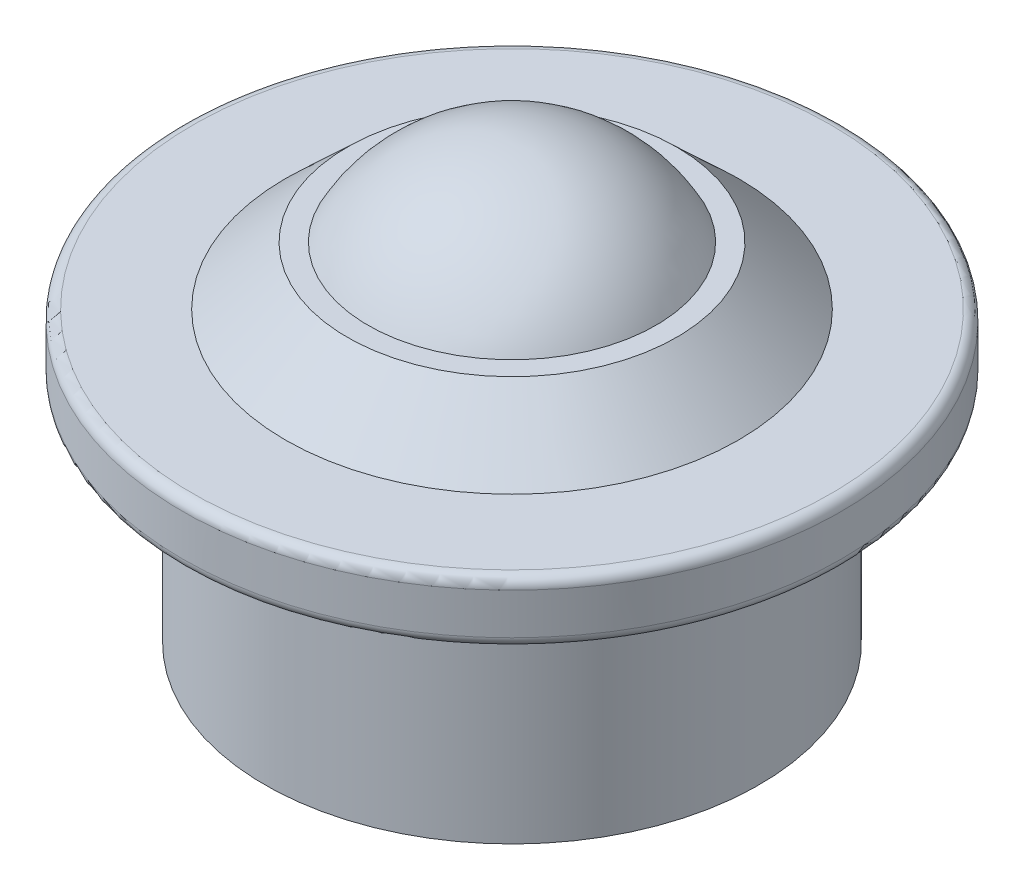
ISO-10303-21;
HEADER;
FILE_DESCRIPTION(('STEP AP214'),'2;1');
FILE_NAME('part.step','',(''),(''),'','','');
FILE_SCHEMA(('AUTOMOTIVE_DESIGN { 1 0 10303 214 1 1 1 1 }'));
ENDSEC;
DATA;
#1=APPLICATION_CONTEXT('core data for automotive mechanical design processes');
#2=APPLICATION_PROTOCOL_DEFINITION('international standard','automotive_design',2000,#1);
#3=PRODUCT_CONTEXT('',#1,'mechanical');
#4=PRODUCT('Part','Part','',(#3));
#5=PRODUCT_RELATED_PRODUCT_CATEGORY('part','',(#4));
#6=PRODUCT_DEFINITION_FORMATION('','',#4);
#7=PRODUCT_DEFINITION_CONTEXT('part definition',#1,'design');
#8=PRODUCT_DEFINITION('design','',#6,#7);
#9=PRODUCT_DEFINITION_SHAPE('','',#8);
#10=(LENGTH_UNIT() NAMED_UNIT(*) SI_UNIT(.MILLI.,.METRE.));
#11=(NAMED_UNIT(*) PLANE_ANGLE_UNIT() SI_UNIT($,.RADIAN.));
#12=(NAMED_UNIT(*) SI_UNIT($,.STERADIAN.) SOLID_ANGLE_UNIT());
#13=UNCERTAINTY_MEASURE_WITH_UNIT(LENGTH_MEASURE(1.E-05),#10,'distance_accuracy_value','');
#14=(GEOMETRIC_REPRESENTATION_CONTEXT(3) GLOBAL_UNCERTAINTY_ASSIGNED_CONTEXT((#13)) GLOBAL_UNIT_ASSIGNED_CONTEXT((#10,
#11,#12)) REPRESENTATION_CONTEXT('',''));
#15=CARTESIAN_POINT('',(0.,0.,0.));
#16=DIRECTION('',(0.,0.,1.));
#17=DIRECTION('',(1.,0.,0.));
#18=AXIS2_PLACEMENT_3D('',#15,#16,#17);
#19=CARTESIAN_POINT('',(0.,13.06,0.));
#20=DIRECTION('',(0.,-1.,0.));
#21=DIRECTION('',(-1.,0.,0.));
#22=AXIS2_PLACEMENT_3D('',#19,#20,#21);
#23=SPHERICAL_SURFACE('',#22,7.94);
#24=CARTESIAN_POINT('',(0.,16.8214587124565,0.));
#25=DIRECTION('',(0.,-1.,0.));
#26=DIRECTION('',(0.,0.,-1.));
#27=AXIS2_PLACEMENT_3D('',#24,#25,#26);
#28=CIRCLE('',#27,6.99249800532578);
#29=CARTESIAN_POINT('',(0.,16.8214587124565,-6.99249800532578));
#30=VERTEX_POINT('',#29);
#31=EDGE_CURVE('E67',#30,#30,#28,.T.);
#32=ORIENTED_EDGE('',*,*,#31,.F.);
#33=EDGE_LOOP('',(#32));
#34=FACE_BOUND('',#33,.T.);
#35=ADVANCED_FACE('F43',(#34),#23,.T.);
#36=CARTESIAN_POINT('',(-8.,16.8214587124565,0.));
#37=DIRECTION('',(0.,-1.,0.));
#38=DIRECTION('',(0.,0.,-1.));
#39=AXIS2_PLACEMENT_3D('',#36,#37,#38);
#40=PLANE('',#39);
#41=CARTESIAN_POINT('',(0.,16.8214587124565,0.));
#42=DIRECTION('',(0.,-1.,0.));
#43=DIRECTION('',(0.,0.,-1.));
#44=AXIS2_PLACEMENT_3D('',#41,#42,#43);
#45=CIRCLE('',#44,8.);
#46=CARTESIAN_POINT('',(0.,16.8214587124565,-8.));
#47=VERTEX_POINT('',#46);
#48=EDGE_CURVE('E71',#47,#47,#45,.T.);
#49=ORIENTED_EDGE('',*,*,#48,.F.);
#50=EDGE_LOOP('',(#49));
#51=FACE_BOUND('',#50,.T.);
#52=ORIENTED_EDGE('',*,*,#31,.T.);
#53=EDGE_LOOP('',(#52));
#54=FACE_BOUND('',#53,.T.);
#55=ADVANCED_FACE('F107',(#51,#54),#40,.F.);
#56=CARTESIAN_POINT('',(0.,16.8214587124565,0.));
#57=DIRECTION('',(0.,-1.,0.));
#58=DIRECTION('',(0.,0.,-1.));
#59=AXIS2_PLACEMENT_3D('',#56,#57,#58);
#60=CONICAL_SURFACE('',#59,8.,0.816058062945723);
#61=CARTESIAN_POINT('',(0.,14.,0.));
#62=DIRECTION('',(0.,-1.,0.));
#63=DIRECTION('',(0.,0.,-1.));
#64=AXIS2_PLACEMENT_3D('',#61,#62,#63);
#65=CIRCLE('',#64,11.);
#66=CARTESIAN_POINT('',(0.,14.,-11.));
#67=VERTEX_POINT('',#66);
#68=EDGE_CURVE('E75',#67,#67,#65,.T.);
#69=ORIENTED_EDGE('',*,*,#68,.F.);
#70=EDGE_LOOP('',(#69));
#71=FACE_BOUND('',#70,.T.);
#72=ORIENTED_EDGE('',*,*,#48,.T.);
#73=EDGE_LOOP('',(#72));
#74=FACE_BOUND('',#73,.T.);
#75=ADVANCED_FACE('F113',(#71,#74),#60,.T.);
#76=CARTESIAN_POINT('',(-16.,14.,0.));
#77=DIRECTION('',(0.,-1.,0.));
#78=DIRECTION('',(0.,0.,-1.));
#79=AXIS2_PLACEMENT_3D('',#76,#77,#78);
#80=PLANE('',#79);
#81=CARTESIAN_POINT('',(0.,14.,0.));
#82=DIRECTION('',(0.,-1.,0.));
#83=DIRECTION('',(0.,0.,-1.));
#84=AXIS2_PLACEMENT_3D('',#81,#82,#83);
#85=CIRCLE('',#84,15.5);
#86=CARTESIAN_POINT('',(0.,14.,-15.5));
#87=VERTEX_POINT('',#86);
#88=EDGE_CURVE('E51',#87,#87,#85,.F.);
#89=ORIENTED_EDGE('',*,*,#88,.T.);
#90=EDGE_LOOP('',(#89));
#91=FACE_BOUND('',#90,.T.);
#92=ORIENTED_EDGE('',*,*,#68,.T.);
#93=EDGE_LOOP('',(#92));
#94=FACE_BOUND('',#93,.T.);
#95=ADVANCED_FACE('F103',(#91,#94),#80,.F.);
#96=CARTESIAN_POINT('',(0.,0.,0.));
#97=DIRECTION('',(0.,-1.,0.));
#98=DIRECTION('',(0.,0.,-1.));
#99=AXIS2_PLACEMENT_3D('',#96,#97,#98);
#100=CYLINDRICAL_SURFACE('',#99,16.);
#101=CARTESIAN_POINT('',(0.,13.5,0.));
#102=DIRECTION('',(0.,-1.,0.));
#103=DIRECTION('',(0.,0.,-1.));
#104=AXIS2_PLACEMENT_3D('',#101,#102,#103);
#105=CIRCLE('',#104,16.);
#106=CARTESIAN_POINT('',(0.,13.5,-16.));
#107=VERTEX_POINT('',#106);
#108=EDGE_CURVE('E56',#107,#107,#105,.T.);
#109=ORIENTED_EDGE('',*,*,#108,.T.);
#110=EDGE_LOOP('',(#109));
#111=FACE_BOUND('',#110,.T.);
#112=CARTESIAN_POINT('',(0.,11.5,0.));
#113=DIRECTION('',(0.,1.,0.));
#114=DIRECTION('',(0.,0.,1.));
#115=AXIS2_PLACEMENT_3D('',#112,#113,#114);
#116=CIRCLE('',#115,16.);
#117=CARTESIAN_POINT('',(0.,11.5,16.));
#118=VERTEX_POINT('',#117);
#119=EDGE_CURVE('E61',#118,#118,#116,.T.);
#120=ORIENTED_EDGE('',*,*,#119,.T.);
#121=EDGE_LOOP('',(#120));
#122=FACE_BOUND('',#121,.T.);
#123=ADVANCED_FACE('F98',(#111,#122),#100,.T.);
#124=CARTESIAN_POINT('',(-12.,11.,0.));
#125=DIRECTION('',(0.,1.,0.));
#126=DIRECTION('',(0.,0.,1.));
#127=AXIS2_PLACEMENT_3D('',#124,#125,#126);
#128=PLANE('',#127);
#129=CARTESIAN_POINT('',(0.,11.,0.));
#130=DIRECTION('',(0.,1.,0.));
#131=DIRECTION('',(0.,0.,1.));
#132=AXIS2_PLACEMENT_3D('',#129,#130,#131);
#133=CIRCLE('',#132,15.5);
#134=CARTESIAN_POINT('',(0.,11.,15.5));
#135=VERTEX_POINT('',#134);
#136=EDGE_CURVE('E10',#135,#135,#133,.F.);
#137=ORIENTED_EDGE('',*,*,#136,.T.);
#138=EDGE_LOOP('',(#137));
#139=FACE_BOUND('',#138,.T.);
#140=CARTESIAN_POINT('',(0.,11.,0.));
#141=DIRECTION('',(0.,-1.,0.));
#142=DIRECTION('',(0.,0.,-1.));
#143=AXIS2_PLACEMENT_3D('',#140,#141,#142);
#144=CIRCLE('',#143,12.);
#145=CARTESIAN_POINT('',(0.,11.,-12.));
#146=VERTEX_POINT('',#145);
#147=EDGE_CURVE('E79',#146,#146,#144,.T.);
#148=ORIENTED_EDGE('',*,*,#147,.F.);
#149=EDGE_LOOP('',(#148));
#150=FACE_BOUND('',#149,.T.);
#151=ADVANCED_FACE('F93',(#139,#150),#128,.F.);
#152=CARTESIAN_POINT('',(0.,0.,0.));
#153=DIRECTION('',(0.,-1.,0.));
#154=DIRECTION('',(0.,0.,-1.));
#155=AXIS2_PLACEMENT_3D('',#152,#153,#154);
#156=CYLINDRICAL_SURFACE('',#155,12.);
#157=CARTESIAN_POINT('',(0.,0.,0.));
#158=DIRECTION('',(0.,-1.,0.));
#159=DIRECTION('',(0.,0.,-1.));
#160=AXIS2_PLACEMENT_3D('',#157,#158,#159);
#161=CIRCLE('',#160,12.);
#162=CARTESIAN_POINT('',(0.,0.,-12.));
#163=VERTEX_POINT('',#162);
#164=EDGE_CURVE('E83',#163,#163,#161,.T.);
#165=ORIENTED_EDGE('',*,*,#164,.F.);
#166=EDGE_LOOP('',(#165));
#167=FACE_BOUND('',#166,.T.);
#168=ORIENTED_EDGE('',*,*,#147,.T.);
#169=EDGE_LOOP('',(#168));
#170=FACE_BOUND('',#169,.T.);
#171=ADVANCED_FACE('F90',(#167,#170),#156,.T.);
#172=CARTESIAN_POINT('',(0.,0.,0.));
#173=DIRECTION('',(0.,1.,0.));
#174=DIRECTION('',(0.,0.,1.));
#175=AXIS2_PLACEMENT_3D('',#172,#173,#174);
#176=PLANE('',#175);
#177=ORIENTED_EDGE('',*,*,#164,.T.);
#178=EDGE_LOOP('',(#177));
#179=FACE_BOUND('',#178,.T.);
#180=ADVANCED_FACE('F88',(#179),#176,.F.);
#181=CARTESIAN_POINT('',(0.,13.5,0.));
#182=DIRECTION('',(0.,-1.,0.));
#183=DIRECTION('',(0.,0.,-1.));
#184=AXIS2_PLACEMENT_3D('',#181,#182,#183);
#185=TOROIDAL_SURFACE('',#184,15.5,0.5);
#186=ORIENTED_EDGE('',*,*,#88,.F.);
#187=EDGE_LOOP('',(#186));
#188=FACE_BOUND('',#187,.T.);
#189=ORIENTED_EDGE('',*,*,#108,.F.);
#190=EDGE_LOOP('',(#189));
#191=FACE_BOUND('',#190,.T.);
#192=ADVANCED_FACE('F118',(#188,#191),#185,.T.);
#193=CARTESIAN_POINT('',(0.,11.5,0.));
#194=DIRECTION('',(0.,1.,0.));
#195=DIRECTION('',(0.,0.,1.));
#196=AXIS2_PLACEMENT_3D('',#193,#194,#195);
#197=TOROIDAL_SURFACE('',#196,15.5,0.5);
#198=ORIENTED_EDGE('',*,*,#119,.F.);
#199=EDGE_LOOP('',(#198));
#200=FACE_BOUND('',#199,.T.);
#201=ORIENTED_EDGE('',*,*,#136,.F.);
#202=EDGE_LOOP('',(#201));
#203=FACE_BOUND('',#202,.T.);
#204=ADVANCED_FACE('F45',(#200,#203),#197,.T.);
#205=CLOSED_SHELL('',(#35,#55,#75,#95,#123,#151,#171,#180,#192,#204));
#206=MANIFOLD_SOLID_BREP('B2',#205);
#207=ADVANCED_BREP_SHAPE_REPRESENTATION('',(#18,#206),#14);
#208=SHAPE_DEFINITION_REPRESENTATION(#9,#207);
ENDSEC;
END-ISO-10303-21;
